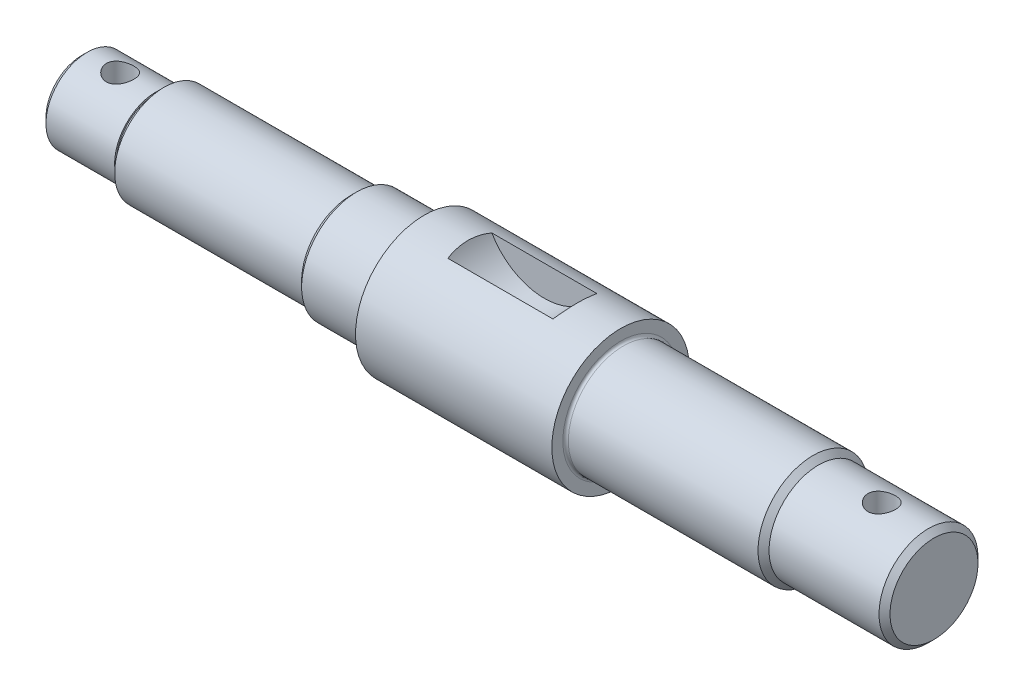
ISO-10303-21;
HEADER;
FILE_DESCRIPTION(('STEP AP214'),'2;1');
FILE_NAME('part.step','',(''),(''),'','','');
FILE_SCHEMA(('AUTOMOTIVE_DESIGN { 1 0 10303 214 1 1 1 1 }'));
ENDSEC;
DATA;
#1=APPLICATION_CONTEXT('core data for automotive mechanical design processes');
#2=APPLICATION_PROTOCOL_DEFINITION('international standard','automotive_design',2000,#1);
#3=PRODUCT_CONTEXT('',#1,'mechanical');
#4=PRODUCT('Part','Part','',(#3));
#5=PRODUCT_RELATED_PRODUCT_CATEGORY('part','',(#4));
#6=PRODUCT_DEFINITION_FORMATION('','',#4);
#7=PRODUCT_DEFINITION_CONTEXT('part definition',#1,'design');
#8=PRODUCT_DEFINITION('design','',#6,#7);
#9=PRODUCT_DEFINITION_SHAPE('','',#8);
#10=(LENGTH_UNIT() NAMED_UNIT(*) SI_UNIT(.MILLI.,.METRE.));
#11=(NAMED_UNIT(*) PLANE_ANGLE_UNIT() SI_UNIT($,.RADIAN.));
#12=(NAMED_UNIT(*) SI_UNIT($,.STERADIAN.) SOLID_ANGLE_UNIT());
#13=UNCERTAINTY_MEASURE_WITH_UNIT(LENGTH_MEASURE(1.E-05),#10,'distance_accuracy_value','');
#14=(GEOMETRIC_REPRESENTATION_CONTEXT(3) GLOBAL_UNCERTAINTY_ASSIGNED_CONTEXT((#13)) GLOBAL_UNIT_ASSIGNED_CONTEXT((#10,
#11,#12)) REPRESENTATION_CONTEXT('',''));
#15=CARTESIAN_POINT('',(0.,0.,0.));
#16=DIRECTION('',(0.,0.,1.));
#17=DIRECTION('',(1.,0.,0.));
#18=AXIS2_PLACEMENT_3D('',#15,#16,#17);
#19=CARTESIAN_POINT('',(155.,0.,0.));
#20=DIRECTION('',(1.,0.,0.));
#21=DIRECTION('',(0.,0.,-1.));
#22=AXIS2_PLACEMENT_3D('',#19,#20,#21);
#23=CYLINDRICAL_SURFACE('',#22,12.5);
#24=CARTESIAN_POINT('',(62.3,0.,0.));
#25=DIRECTION('',(1.,0.,0.));
#26=DIRECTION('',(0.,0.,-1.));
#27=AXIS2_PLACEMENT_3D('',#24,#25,#26);
#28=CIRCLE('',#27,12.5);
#29=CARTESIAN_POINT('',(62.3,0.,-12.5));
#30=VERTEX_POINT('',#29);
#31=EDGE_CURVE('E165',#30,#30,#28,.T.);
#32=ORIENTED_EDGE('',*,*,#31,.T.);
#33=EDGE_LOOP('',(#32));
#34=FACE_BOUND('',#33,.T.);
#35=CARTESIAN_POINT('',(98.,0.,0.));
#36=DIRECTION('',(1.,0.,0.));
#37=DIRECTION('',(0.,0.,-1.));
#38=AXIS2_PLACEMENT_3D('',#35,#36,#37);
#39=CIRCLE('',#38,12.5);
#40=CARTESIAN_POINT('',(98.,0.,-12.5));
#41=VERTEX_POINT('',#40);
#42=EDGE_CURVE('E168',#41,#41,#39,.T.);
#43=ORIENTED_EDGE('',*,*,#42,.F.);
#44=EDGE_LOOP('',(#43));
#45=FACE_BOUND('',#44,.T.);
#46=CARTESIAN_POINT('',(70.5991839527444,11.842719282327,-4.));
#47=CARTESIAN_POINT('',(70.5711926830263,11.8917156117757,-3.85494402529168));
#48=CARTESIAN_POINT('',(70.5451553475251,11.9381490672679,-3.70867030879479));
#49=CARTESIAN_POINT('',(70.4967755975671,12.0257437372073,-3.41395853570055));
#50=CARTESIAN_POINT('',(70.4744329601395,12.0669052697751,-3.26552061029944));
#51=CARTESIAN_POINT('',(70.4126424578915,12.1822344055781,-2.8174816413634));
#52=CARTESIAN_POINT('',(70.3784059982553,12.2482930461569,-2.51501804161143));
#53=CARTESIAN_POINT('',(70.3224635699344,12.3580046221654,-1.90427101375402));
#54=CARTESIAN_POINT('',(70.300785509179,12.4016076318492,-1.59597618401057));
#55=CARTESIAN_POINT('',(70.2691690979051,12.4656995854591,-0.976382997723523));
#56=CARTESIAN_POINT('',(70.2592310584647,12.4861879169095,-0.665084561812997));
#57=CARTESIAN_POINT('',(70.2506716327463,12.5038147620794,-0.0418568247993486));
#58=CARTESIAN_POINT('',(70.2520437568093,12.500966666014,0.270072011868759));
#59=CARTESIAN_POINT('',(70.2661500567885,12.4719806173032,0.892642047172848));
#60=CARTESIAN_POINT('',(70.2788859218021,12.4458392023584,1.20328304748952));
#61=CARTESIAN_POINT('',(70.3162146723074,12.3706573639039,1.82020810943418));
#62=CARTESIAN_POINT('',(70.3407757697093,12.3216783425542,2.12650159839234));
#63=CARTESIAN_POINT('',(70.4027332735505,12.201434168835,2.73322605572648));
#64=CARTESIAN_POINT('',(70.4401214359915,12.130183333244,3.03366065887986));
#65=CARTESIAN_POINT('',(70.5015912906785,12.0170604757192,3.44296739669271));
#66=CARTESIAN_POINT('',(70.5195928788041,11.9842876759461,3.55535041723217));
#67=CARTESIAN_POINT('',(70.5577481662195,11.9157411691357,3.77872220549976));
#68=CARTESIAN_POINT('',(70.5779000436322,11.8799700079478,3.88971206587697));
#69=CARTESIAN_POINT('',(70.5991839527444,11.842719282327,4.));
#70=B_SPLINE_CURVE_WITH_KNOTS('',3,(#46,#47,#48,#49,#50,#51,#52,#53,#54,#55,#56,#57,#58,#59,#60,
#61,#62,#63,#64,#65,#66,#67,#68,#69),.UNSPECIFIED.,.F.,.F.,(4,2,2,2,2,2,2,2,2,2,2,4),(0.,
0.466853020500423,0.933677856670467,1.86688702951262,2.8021621510291,3.73746205419398,
4.67222532897254,5.6071275693648,6.53953055913781,7.47133540948988,7.82660392793132,
8.18157379263428),.UNSPECIFIED.);
#71=CARTESIAN_POINT('',(70.5991839527444,11.842719282327,-4.));
#72=VERTEX_POINT('',#71);
#73=CARTESIAN_POINT('',(70.5991839527444,11.842719282327,4.));
#74=VERTEX_POINT('',#73);
#75=EDGE_CURVE('E54',#72,#74,#70,.T.);
#76=ORIENTED_EDGE('',*,*,#75,.F.);
#77=DIRECTION('',(1.,0.,0.));
#78=VECTOR('',#77,1.);
#79=CARTESIAN_POINT('',(155.,11.842719282327,-4.));
#80=LINE('',#79,#78);
#81=CARTESIAN_POINT('',(89.7008160472555,11.842719282327,-4.));
#82=VERTEX_POINT('',#81);
#83=EDGE_CURVE('E11',#72,#82,#80,.T.);
#84=ORIENTED_EDGE('',*,*,#83,.T.);
#85=CARTESIAN_POINT('',(89.7008160472555,11.842719282327,4.));
#86=CARTESIAN_POINT('',(89.7288073169737,11.8917156117757,3.85494402529168));
#87=CARTESIAN_POINT('',(89.7548446524748,11.9381490672679,3.70867030879479));
#88=CARTESIAN_POINT('',(89.8032244024328,12.0257437372073,3.41395853570055));
#89=CARTESIAN_POINT('',(89.8255670398605,12.0669052697751,3.26552061029944));
#90=CARTESIAN_POINT('',(89.8873575421085,12.1822344055781,2.8174816413634));
#91=CARTESIAN_POINT('',(89.9215940017447,12.2482930461569,2.51501804161143));
#92=CARTESIAN_POINT('',(89.9775364300656,12.3580046221654,1.90427101375402));
#93=CARTESIAN_POINT('',(89.9992144908209,12.4016076318492,1.59597618401057));
#94=CARTESIAN_POINT('',(90.0308309020948,12.4656995854591,0.976382997723524));
#95=CARTESIAN_POINT('',(90.0407689415353,12.4861879169095,0.665084561812998));
#96=CARTESIAN_POINT('',(90.0493283672536,12.5038147620794,0.0418568247993486));
#97=CARTESIAN_POINT('',(90.0479562431906,12.500966666014,-0.270072011868759));
#98=CARTESIAN_POINT('',(90.0338499432114,12.4719806173032,-0.892642047172848));
#99=CARTESIAN_POINT('',(90.0211140781979,12.4458392023584,-1.20328304748952));
#100=CARTESIAN_POINT('',(89.9837853276925,12.3706573639039,-1.82020810943418));
#101=CARTESIAN_POINT('',(89.9592242302906,12.3216783425542,-2.12650159839234));
#102=CARTESIAN_POINT('',(89.8972667264494,12.201434168835,-2.73322605572648));
#103=CARTESIAN_POINT('',(89.8598785640084,12.130183333244,-3.03366065887986));
#104=CARTESIAN_POINT('',(89.7984087093215,12.0170604757192,-3.44296739669271));
#105=CARTESIAN_POINT('',(89.7804071211958,11.9842876759461,-3.55535041723217));
#106=CARTESIAN_POINT('',(89.7422518337805,11.9157411691357,-3.77872220549976));
#107=CARTESIAN_POINT('',(89.7220999563677,11.8799700079478,-3.88971206587697));
#108=CARTESIAN_POINT('',(89.7008160472555,11.842719282327,-4.));
#109=B_SPLINE_CURVE_WITH_KNOTS('',3,(#85,#86,#87,#88,#89,#90,#91,#92,#93,#94,#95,#96,#97,#98,
#99,#100,#101,#102,#103,#104,#105,#106,#107,#108),.UNSPECIFIED.,.F.,.F.,(4,2,2,2,2,2,2,2,2,2,2,
4),(0.,0.466853020500423,0.933677856670467,1.86688702951262,2.8021621510291,3.73746205419398,
4.67222532897254,5.6071275693648,6.53953055913781,7.47133540948988,7.82660392793132,
8.18157379263428),.UNSPECIFIED.);
#110=CARTESIAN_POINT('',(89.7008160472555,11.842719282327,4.));
#111=VERTEX_POINT('',#110);
#112=EDGE_CURVE('E68',#111,#82,#109,.T.);
#113=ORIENTED_EDGE('',*,*,#112,.F.);
#114=DIRECTION('',(1.,0.,0.));
#115=VECTOR('',#114,1.);
#116=CARTESIAN_POINT('',(155.,11.842719282327,4.));
#117=LINE('',#116,#115);
#118=EDGE_CURVE('E75',#74,#111,#117,.T.);
#119=ORIENTED_EDGE('',*,*,#118,.F.);
#120=EDGE_LOOP('',(#76,#84,#113,#119));
#121=FACE_BOUND('',#120,.T.);
#122=ADVANCED_FACE('F39',(#34,#45,#121),#23,.T.);
#123=CARTESIAN_POINT('',(155.,8.99999999999998,0.));
#124=DIRECTION('',(1.,0.,0.));
#125=DIRECTION('',(0.,0.,-1.));
#126=AXIS2_PLACEMENT_3D('',#123,#124,#125);
#127=PLANE('',#126);
#128=CARTESIAN_POINT('',(155.,0.,0.));
#129=DIRECTION('',(1.,0.,0.));
#130=DIRECTION('',(0.,0.,-1.));
#131=AXIS2_PLACEMENT_3D('',#128,#129,#130);
#132=CIRCLE('',#131,7.99999999999999);
#133=CARTESIAN_POINT('',(155.,0.,-7.99999999999999));
#134=VERTEX_POINT('',#133);
#135=EDGE_CURVE('E187',#134,#134,#132,.T.);
#136=ORIENTED_EDGE('',*,*,#135,.T.);
#137=EDGE_LOOP('',(#136));
#138=FACE_BOUND('',#137,.T.);
#139=ADVANCED_FACE('F155',(#138),#127,.T.);
#140=CARTESIAN_POINT('',(155.,0.,0.));
#141=DIRECTION('',(1.,0.,0.));
#142=DIRECTION('',(0.,0.,-1.));
#143=AXIS2_PLACEMENT_3D('',#140,#141,#142);
#144=CYLINDRICAL_SURFACE('',#143,8.99999999999998);
#145=CARTESIAN_POINT('',(145.5,-8.64580823289528,2.5));
#146=CARTESIAN_POINT('',(145.36251304671,-8.64581037496085,2.49999714996617));
#147=CARTESIAN_POINT('',(145.224996759927,-8.64912360937158,2.48861977425243));
#148=CARTESIAN_POINT('',(144.953951404569,-8.66197474072457,2.44350693717148));
#149=CARTESIAN_POINT('',(144.820424144722,-8.6715154178623,2.40976148964065));
#150=CARTESIAN_POINT('',(144.561317673241,-8.69565935423006,2.32112008680784));
#151=CARTESIAN_POINT('',(144.435726959246,-8.71025507855493,2.26625559744292));
#152=CARTESIAN_POINT('',(144.195509077945,-8.74285475062132,2.13703377417483));
#153=CARTESIAN_POINT('',(144.080883025715,-8.76085904445196,2.06267446056934));
#154=CARTESIAN_POINT('',(143.862738144417,-8.79879482245344,1.89441531907551));
#155=CARTESIAN_POINT('',(143.759560882364,-8.81876275539878,1.80008077870934));
#156=CARTESIAN_POINT('',(143.570269160961,-8.85806239814546,1.59548286960025));
#157=CARTESIAN_POINT('',(143.484156600035,-8.8773940369607,1.4852177309572));
#158=CARTESIAN_POINT('',(143.329995538839,-8.91365202741972,1.24950042890598));
#159=CARTESIAN_POINT('',(143.262289408156,-8.93053038427287,1.12381632761082));
#160=CARTESIAN_POINT('',(143.14910072624,-8.95956018312962,0.862300362049417));
#161=CARTESIAN_POINT('',(143.103614095426,-8.97171249276933,0.726470365890889));
#162=CARTESIAN_POINT('',(143.037269054527,-8.98966318340412,0.452086360205861));
#163=CARTESIAN_POINT('',(143.015828957739,-8.99561138050701,0.313682975067015));
#164=CARTESIAN_POINT('',(142.996352543344,-9.0010086738428,0.0351244568787243));
#165=CARTESIAN_POINT('',(142.998311988443,-9.00045894674932,-0.105030354422782));
#166=CARTESIAN_POINT('',(143.025175552384,-8.99303086374214,-0.379054247152551));
#167=CARTESIAN_POINT('',(143.049450763969,-8.98632598075259,-0.512990410045104));
#168=CARTESIAN_POINT('',(143.119237138233,-8.96754760099032,-0.774807483322486));
#169=CARTESIAN_POINT('',(143.164749560655,-8.95547378574643,-0.902688034006093));
#170=CARTESIAN_POINT('',(143.276182080583,-8.92706250606228,-1.15033359179949));
#171=CARTESIAN_POINT('',(143.342311909524,-8.91068150784285,-1.26999902658789));
#172=CARTESIAN_POINT('',(143.49293961582,-8.87541221350136,-1.49674457308827));
#173=CARTESIAN_POINT('',(143.577441332692,-8.85652339359455,-1.60382204684013));
#174=CARTESIAN_POINT('',(143.765728657777,-8.81753663226072,-1.8061067603823));
#175=CARTESIAN_POINT('',(143.870061805646,-8.79741936953616,-1.90080125058981));
#176=CARTESIAN_POINT('',(144.093332675122,-8.75880383152744,-2.07148108085114));
#177=CARTESIAN_POINT('',(144.212271450118,-8.74030567318145,-2.14746507027558));
#178=CARTESIAN_POINT('',(144.462564721412,-8.70694013940654,-2.27900238121954));
#179=CARTESIAN_POINT('',(144.594002269306,-8.69209980055973,-2.3344050164098));
#180=CARTESIAN_POINT('',(144.864843595759,-8.66806022503137,-2.42215297643583));
#181=CARTESIAN_POINT('',(145.00424519225,-8.65885945119344,-2.45450458459976));
#182=CARTESIAN_POINT('',(145.282234513998,-8.64747148287151,-2.49432455486228));
#183=CARTESIAN_POINT('',(145.420703234809,-8.64506746157859,-2.50256249342185));
#184=CARTESIAN_POINT('',(145.697041990452,-8.64694988564763,-2.49605092061448));
#185=CARTESIAN_POINT('',(145.83491209335,-8.6512355492528,-2.48130409524807));
#186=CARTESIAN_POINT('',(146.103097746691,-8.66580389953323,-2.42992241428478));
#187=CARTESIAN_POINT('',(146.233511668847,-8.67595686836149,-2.39376059864354));
#188=CARTESIAN_POINT('',(146.486420227101,-8.70098664146815,-2.30111259188306));
#189=CARTESIAN_POINT('',(146.60891376272,-8.71586410048918,-2.24462358357885));
#190=CARTESIAN_POINT('',(146.845695368558,-8.74910362417901,-2.11139571215837));
#191=CARTESIAN_POINT('',(146.959721771038,-8.76753959855499,-2.03421067264883));
#192=CARTESIAN_POINT('',(147.173486244076,-8.80564999409986,-1.86232721847474));
#193=CARTESIAN_POINT('',(147.273221384664,-8.82532466803798,-1.76762522160664));
#194=CARTESIAN_POINT('',(147.458821470568,-8.86445019939345,-1.55981743646719));
#195=CARTESIAN_POINT('',(147.544146810068,-8.88387421295945,-1.4462235987098));
#196=CARTESIAN_POINT('',(147.694523971078,-8.91967402878591,-1.20588311286947));
#197=CARTESIAN_POINT('',(147.759576866794,-8.93604999253945,-1.07913716217182));
#198=CARTESIAN_POINT('',(147.866949591823,-8.96380327787491,-0.816978395233246));
#199=CARTESIAN_POINT('',(147.909441166067,-8.97521823979381,-0.681640101050656));
#200=CARTESIAN_POINT('',(147.970968173441,-8.99192942838895,-0.405376312895347));
#201=CARTESIAN_POINT('',(147.990009283144,-8.99722713582852,-0.264452179596259));
#202=CARTESIAN_POINT('',(148.003714329686,-9.00103042209331,0.013960152357653));
#203=CARTESIAN_POINT('',(147.999166707091,-8.99975568986335,0.151407064589656));
#204=CARTESIAN_POINT('',(147.967671437509,-8.99106088846501,0.423500619727726));
#205=CARTESIAN_POINT('',(147.94072476243,-8.98364108593444,0.55814738387382));
#206=CARTESIAN_POINT('',(147.865656776372,-8.96353984091203,0.819784983469313));
#207=CARTESIAN_POINT('',(147.817707402067,-8.95090116936264,0.946828656281146));
#208=CARTESIAN_POINT('',(147.702148061769,-8.92167820297649,1.19113920788314));
#209=CARTESIAN_POINT('',(147.634535166621,-8.90509332036377,1.30840462671538));
#210=CARTESIAN_POINT('',(147.479328057284,-8.86915397347005,1.53345112172908));
#211=CARTESIAN_POINT('',(147.391219913931,-8.84973411731034,1.64086726646983));
#212=CARTESIAN_POINT('',(147.198482069549,-8.81055920809078,1.83965563573723));
#213=CARTESIAN_POINT('',(147.093847901953,-8.79080406570365,1.93102350868099));
#214=CARTESIAN_POINT('',(146.867955482556,-8.7526355351999,2.09734241907801));
#215=CARTESIAN_POINT('',(146.746353610468,-8.73426670491593,2.17183796747971));
#216=CARTESIAN_POINT('',(146.491856012821,-8.70160385709123,2.29922652645138));
#217=CARTESIAN_POINT('',(146.35896712682,-8.68730739437857,2.35213250833711));
#218=CARTESIAN_POINT('',(146.105639870262,-8.66621345779748,2.42859494882474));
#219=CARTESIAN_POINT('',(145.986210594444,-8.65862660680176,2.45530563406018));
#220=CARTESIAN_POINT('',(145.744528351776,-8.64842338463343,2.49100820491654));
#221=CARTESIAN_POINT('',(145.622275776788,-8.64580632782192,2.50000253471396));
#222=CARTESIAN_POINT('',(145.5,-8.64580823289528,2.5));
#223=B_SPLINE_CURVE_WITH_KNOTS('',3,(#145,#146,#147,#148,#149,#150,#151,#152,#153,#154,#155,
#156,#157,#158,#159,#160,#161,#162,#163,#164,#165,#166,#167,#168,#169,#170,#171,#172,#173,#174,
#175,#176,#177,#178,#179,#180,#181,#182,#183,#184,#185,#186,#187,#188,#189,#190,#191,#192,#193,
#194,#195,#196,#197,#198,#199,#200,#201,#202,#203,#204,#205,#206,#207,#208,#209,#210,#211,#212,
#213,#214,#215,#216,#217,#218,#219,#220,#221,#222),.UNSPECIFIED.,.T.,.F.,(4,2,2,2,2,2,2,2,2,2,2,
2,2,2,2,2,2,2,2,2,2,2,2,2,2,2,2,2,2,2,2,2,2,2,2,2,2,2,4),(0.,0.412010791688976,
0.824205648454525,1.23578872527859,1.64741361462618,2.06913895760033,2.49091119062406,
2.92006196750631,3.34913392107922,3.7675863122474,4.18596292931721,4.59289867518081,
4.99985856264056,5.41110133303431,5.82243013129567,6.24742875551485,6.67245804954201,
7.10054057407687,7.52850636571891,7.94265637768503,8.35675799569093,8.76203677700907,
9.1673717483445,9.58226667645628,9.99724654423655,10.4253750626708,10.8534808913584,
11.2782793253857,11.7029749096957,12.1135686473819,12.5241445701256,12.9314203987337,
13.3387569278366,13.7576868945778,14.1767302818544,14.6060087946726,15.0350290098244,
15.4015066296816,15.767933686163),.UNSPECIFIED.);
#224=CARTESIAN_POINT('',(145.5,-8.64580823289528,2.5));
#225=VERTEX_POINT('',#224);
#226=EDGE_CURVE('E44',#225,#225,#223,.T.);
#227=ORIENTED_EDGE('',*,*,#226,.F.);
#228=EDGE_LOOP('',(#227));
#229=FACE_BOUND('',#228,.T.);
#230=CARTESIAN_POINT('',(145.5,8.64580823289528,2.5));
#231=CARTESIAN_POINT('',(145.63748695329,8.64581037496085,2.49999714996617));
#232=CARTESIAN_POINT('',(145.775003240073,8.64912360937158,2.48861977425243));
#233=CARTESIAN_POINT('',(146.046048595431,8.66197474072457,2.44350693717148));
#234=CARTESIAN_POINT('',(146.179575855278,8.6715154178623,2.40976148964064));
#235=CARTESIAN_POINT('',(146.43868232676,8.69565935423006,2.32112008680784));
#236=CARTESIAN_POINT('',(146.564273040754,8.71025507855493,2.26625559744292));
#237=CARTESIAN_POINT('',(146.804490922055,8.74285475062132,2.13703377417483));
#238=CARTESIAN_POINT('',(146.919116974285,8.76085904445196,2.06267446056934));
#239=CARTESIAN_POINT('',(147.137261855583,8.79879482245344,1.89441531907551));
#240=CARTESIAN_POINT('',(147.240439117636,8.81876275539877,1.80008077870935));
#241=CARTESIAN_POINT('',(147.429730839039,8.85806239814545,1.59548286960026));
#242=CARTESIAN_POINT('',(147.515843399965,8.8773940369607,1.4852177309572));
#243=CARTESIAN_POINT('',(147.670004461161,8.91365202741972,1.24950042890599));
#244=CARTESIAN_POINT('',(147.737710591844,8.93053038427287,1.12381632761083));
#245=CARTESIAN_POINT('',(147.85089927376,8.95956018312962,0.862300362049432));
#246=CARTESIAN_POINT('',(147.896385904574,8.97171249276933,0.726470365890896));
#247=CARTESIAN_POINT('',(147.962730945473,8.98966318340412,0.45208636020586));
#248=CARTESIAN_POINT('',(147.984171042261,8.99561138050701,0.313682975067014));
#249=CARTESIAN_POINT('',(148.003647456656,9.0010086738428,0.0351244568787245));
#250=CARTESIAN_POINT('',(148.001688011557,9.00045894674932,-0.105030354422782));
#251=CARTESIAN_POINT('',(147.974824447616,8.99303086374214,-0.379054247152551));
#252=CARTESIAN_POINT('',(147.950549236031,8.98632598075259,-0.512990410045104));
#253=CARTESIAN_POINT('',(147.880762861767,8.96754760099032,-0.774807483322486));
#254=CARTESIAN_POINT('',(147.835250439345,8.95547378574643,-0.902688034006093));
#255=CARTESIAN_POINT('',(147.723817919417,8.92706250606228,-1.15033359179949));
#256=CARTESIAN_POINT('',(147.657688090476,8.91068150784285,-1.26999902658789));
#257=CARTESIAN_POINT('',(147.50706038418,8.87541221350136,-1.49674457308827));
#258=CARTESIAN_POINT('',(147.422558667308,8.85652339359455,-1.60382204684013));
#259=CARTESIAN_POINT('',(147.234271342223,8.81753663226072,-1.8061067603823));
#260=CARTESIAN_POINT('',(147.129938194354,8.79741936953616,-1.9008012505898));
#261=CARTESIAN_POINT('',(146.906667324878,8.75880383152744,-2.07148108085113));
#262=CARTESIAN_POINT('',(146.787728549882,8.74030567318145,-2.14746507027557));
#263=CARTESIAN_POINT('',(146.537435278588,8.70694013940654,-2.27900238121954));
#264=CARTESIAN_POINT('',(146.405997730694,8.69209980055973,-2.3344050164098));
#265=CARTESIAN_POINT('',(146.135156404241,8.66806022503137,-2.42215297643583));
#266=CARTESIAN_POINT('',(145.99575480775,8.65885945119344,-2.45450458459976));
#267=CARTESIAN_POINT('',(145.717765486002,8.64747148287151,-2.49432455486228));
#268=CARTESIAN_POINT('',(145.579296765191,8.64506746157859,-2.50256249342185));
#269=CARTESIAN_POINT('',(145.302958009548,8.64694988564763,-2.49605092061448));
#270=CARTESIAN_POINT('',(145.16508790665,8.6512355492528,-2.48130409524807));
#271=CARTESIAN_POINT('',(144.896902253309,8.66580389953323,-2.42992241428478));
#272=CARTESIAN_POINT('',(144.766488331153,8.67595686836149,-2.39376059864354));
#273=CARTESIAN_POINT('',(144.513579772899,8.70098664146815,-2.30111259188306));
#274=CARTESIAN_POINT('',(144.39108623728,8.71586410048918,-2.24462358357885));
#275=CARTESIAN_POINT('',(144.154304631442,8.74910362417901,-2.11139571215837));
#276=CARTESIAN_POINT('',(144.040278228962,8.76753959855499,-2.03421067264883));
#277=CARTESIAN_POINT('',(143.826513755924,8.80564999409986,-1.86232721847474));
#278=CARTESIAN_POINT('',(143.726778615336,8.82532466803798,-1.76762522160664));
#279=CARTESIAN_POINT('',(143.541178529432,8.86445019939345,-1.55981743646719));
#280=CARTESIAN_POINT('',(143.455853189932,8.88387421295945,-1.4462235987098));
#281=CARTESIAN_POINT('',(143.305476028923,8.91967402878591,-1.20588311286947));
#282=CARTESIAN_POINT('',(143.240423133206,8.93604999253945,-1.07913716217182));
#283=CARTESIAN_POINT('',(143.133050408177,8.96380327787491,-0.816978395233246));
#284=CARTESIAN_POINT('',(143.090558833933,8.97521823979381,-0.681640101050656));
#285=CARTESIAN_POINT('',(143.029031826559,8.99192942838895,-0.405376312895347));
#286=CARTESIAN_POINT('',(143.009990716856,8.99722713582852,-0.264452179596259));
#287=CARTESIAN_POINT('',(142.996285670314,9.00103042209331,0.013960152357653));
#288=CARTESIAN_POINT('',(143.000833292909,8.99975568986335,0.151407064589656));
#289=CARTESIAN_POINT('',(143.032328562491,8.99106088846501,0.423500619727726));
#290=CARTESIAN_POINT('',(143.05927523757,8.98364108593444,0.55814738387382));
#291=CARTESIAN_POINT('',(143.134343223628,8.96353984091203,0.819784983469313));
#292=CARTESIAN_POINT('',(143.182292597933,8.95090116936264,0.946828656281146));
#293=CARTESIAN_POINT('',(143.297851938231,8.92167820297649,1.19113920788314));
#294=CARTESIAN_POINT('',(143.365464833379,8.90509332036377,1.30840462671538));
#295=CARTESIAN_POINT('',(143.520671942716,8.86915397347005,1.53345112172909));
#296=CARTESIAN_POINT('',(143.608780086069,8.84973411731034,1.64086726646984));
#297=CARTESIAN_POINT('',(143.801517930452,8.81055920809078,1.83965563573725));
#298=CARTESIAN_POINT('',(143.906152098048,8.79080406570365,1.931023508681));
#299=CARTESIAN_POINT('',(144.132044517444,8.7526355351999,2.09734241907802));
#300=CARTESIAN_POINT('',(144.253646389532,8.73426670491592,2.17183796747972));
#301=CARTESIAN_POINT('',(144.508143987179,8.70160385709123,2.29922652645138));
#302=CARTESIAN_POINT('',(144.64103287318,8.68730739437857,2.35213250833712));
#303=CARTESIAN_POINT('',(144.894360129738,8.66621345779748,2.42859494882474));
#304=CARTESIAN_POINT('',(145.013789405556,8.65862660680176,2.45530563406018));
#305=CARTESIAN_POINT('',(145.255471648224,8.64842338463343,2.49100820491654));
#306=CARTESIAN_POINT('',(145.377724223212,8.64580632782192,2.50000253471396));
#307=CARTESIAN_POINT('',(145.5,8.64580823289528,2.5));
#308=B_SPLINE_CURVE_WITH_KNOTS('',3,(#230,#231,#232,#233,#234,#235,#236,#237,#238,#239,#240,
#241,#242,#243,#244,#245,#246,#247,#248,#249,#250,#251,#252,#253,#254,#255,#256,#257,#258,#259,
#260,#261,#262,#263,#264,#265,#266,#267,#268,#269,#270,#271,#272,#273,#274,#275,#276,#277,#278,
#279,#280,#281,#282,#283,#284,#285,#286,#287,#288,#289,#290,#291,#292,#293,#294,#295,#296,#297,
#298,#299,#300,#301,#302,#303,#304,#305,#306,#307),.UNSPECIFIED.,.T.,.F.,(4,2,2,2,2,2,2,2,2,2,2,
2,2,2,2,2,2,2,2,2,2,2,2,2,2,2,2,2,2,2,2,2,2,2,2,2,2,2,4),(0.,0.412010791688976,
0.824205648454525,1.23578872527859,1.64741361462618,2.06913895760032,2.49091119062406,
2.92006196750629,3.34913392107923,3.7675863122474,4.18596292931722,4.59289867518081,
4.99985856264056,5.41110133303432,5.82243013129567,6.24742875551482,6.67245804954201,
7.10054057407687,7.52850636571892,7.94265637768504,8.35675799569093,8.76203677700908,
9.16737174834451,9.58226667645629,9.99724654423655,10.4253750626708,10.8534808913584,
11.2782793253857,11.7029749096957,12.1135686473819,12.5241445701257,12.9314203987337,
13.3387569278366,13.7576868945778,14.1767302818544,14.6060087946726,15.0350290098244,
15.4015066296816,15.767933686163),.UNSPECIFIED.);
#309=CARTESIAN_POINT('',(145.5,8.64580823289528,2.5));
#310=VERTEX_POINT('',#309);
#311=EDGE_CURVE('E135',#310,#310,#308,.T.);
#312=ORIENTED_EDGE('',*,*,#311,.F.);
#313=EDGE_LOOP('',(#312));
#314=FACE_BOUND('',#313,.T.);
#315=CARTESIAN_POINT('',(154.,0.,0.));
#316=DIRECTION('',(1.,0.,0.));
#317=DIRECTION('',(0.,0.,-1.));
#318=AXIS2_PLACEMENT_3D('',#315,#316,#317);
#319=CIRCLE('',#318,8.99999999999998);
#320=CARTESIAN_POINT('',(154.,0.,-8.99999999999998));
#321=VERTEX_POINT('',#320);
#322=EDGE_CURVE('E79',#321,#321,#319,.F.);
#323=ORIENTED_EDGE('',*,*,#322,.T.);
#324=EDGE_LOOP('',(#323));
#325=FACE_BOUND('',#324,.T.);
#326=CARTESIAN_POINT('',(134.,0.,0.));
#327=DIRECTION('',(1.,0.,0.));
#328=DIRECTION('',(0.,0.,-1.));
#329=AXIS2_PLACEMENT_3D('',#326,#327,#328);
#330=CIRCLE('',#329,8.99999999999998);
#331=CARTESIAN_POINT('',(134.,0.,-8.99999999999998));
#332=VERTEX_POINT('',#331);
#333=EDGE_CURVE('E184',#332,#332,#330,.T.);
#334=ORIENTED_EDGE('',*,*,#333,.T.);
#335=EDGE_LOOP('',(#334));
#336=FACE_BOUND('',#335,.T.);
#337=ADVANCED_FACE('F160',(#229,#314,#325,#336),#144,.T.);
#338=CARTESIAN_POINT('',(134.,0.,0.));
#339=DIRECTION('',(-1.,0.,0.));
#340=DIRECTION('',(0.,0.,1.));
#341=AXIS2_PLACEMENT_3D('',#338,#339,#340);
#342=CONICAL_SURFACE('',#341,8.99999999999998,0.785398163397436);
#343=CARTESIAN_POINT('',(133.,0.,0.));
#344=DIRECTION('',(1.,0.,0.));
#345=DIRECTION('',(0.,0.,-1.));
#346=AXIS2_PLACEMENT_3D('',#343,#344,#345);
#347=CIRCLE('',#346,9.99999999999999);
#348=CARTESIAN_POINT('',(133.,0.,-9.99999999999999));
#349=VERTEX_POINT('',#348);
#350=EDGE_CURVE('E181',#349,#349,#347,.T.);
#351=ORIENTED_EDGE('',*,*,#350,.T.);
#352=EDGE_LOOP('',(#351));
#353=FACE_BOUND('',#352,.T.);
#354=ORIENTED_EDGE('',*,*,#333,.F.);
#355=EDGE_LOOP('',(#354));
#356=FACE_BOUND('',#355,.T.);
#357=ADVANCED_FACE('F232',(#353,#356),#342,.T.);
#358=CARTESIAN_POINT('',(155.,0.,0.));
#359=DIRECTION('',(1.,0.,0.));
#360=DIRECTION('',(0.,0.,-1.));
#361=AXIS2_PLACEMENT_3D('',#358,#359,#360);
#362=CYLINDRICAL_SURFACE('',#361,9.99999999999999);
#363=CARTESIAN_POINT('',(98.5,0.,0.));
#364=DIRECTION('',(1.,0.,0.));
#365=DIRECTION('',(0.,0.,-1.));
#366=AXIS2_PLACEMENT_3D('',#363,#364,#365);
#367=CIRCLE('',#366,9.99999999999999);
#368=CARTESIAN_POINT('',(98.5,0.,-9.99999999999999));
#369=VERTEX_POINT('',#368);
#370=EDGE_CURVE('E173',#369,#369,#367,.T.);
#371=ORIENTED_EDGE('',*,*,#370,.T.);
#372=EDGE_LOOP('',(#371));
#373=FACE_BOUND('',#372,.T.);
#374=ORIENTED_EDGE('',*,*,#350,.F.);
#375=EDGE_LOOP('',(#374));
#376=FACE_BOUND('',#375,.T.);
#377=ADVANCED_FACE('F374',(#373,#376),#362,.T.);
#378=CARTESIAN_POINT('',(98.5,0.,0.));
#379=DIRECTION('',(1.,0.,0.));
#380=DIRECTION('',(0.,0.,-1.));
#381=AXIS2_PLACEMENT_3D('',#378,#379,#380);
#382=TOROIDAL_SURFACE('',#381,10.5,0.5);
#383=CARTESIAN_POINT('',(98.,0.,0.));
#384=DIRECTION('',(1.,0.,0.));
#385=DIRECTION('',(0.,0.,-1.));
#386=AXIS2_PLACEMENT_3D('',#383,#384,#385);
#387=CIRCLE('',#386,10.5);
#388=CARTESIAN_POINT('',(98.,0.,-10.5));
#389=VERTEX_POINT('',#388);
#390=EDGE_CURVE('E170',#389,#389,#387,.T.);
#391=ORIENTED_EDGE('',*,*,#390,.T.);
#392=EDGE_LOOP('',(#391));
#393=FACE_BOUND('',#392,.T.);
#394=ORIENTED_EDGE('',*,*,#370,.F.);
#395=EDGE_LOOP('',(#394));
#396=FACE_BOUND('',#395,.T.);
#397=ADVANCED_FACE('F366',(#393,#396),#382,.F.);
#398=CARTESIAN_POINT('',(98.,12.5,0.));
#399=DIRECTION('',(1.,0.,0.));
#400=DIRECTION('',(0.,0.,-1.));
#401=AXIS2_PLACEMENT_3D('',#398,#399,#400);
#402=PLANE('',#401);
#403=ORIENTED_EDGE('',*,*,#42,.T.);
#404=EDGE_LOOP('',(#403));
#405=FACE_BOUND('',#404,.T.);
#406=ORIENTED_EDGE('',*,*,#390,.F.);
#407=EDGE_LOOP('',(#406));
#408=FACE_BOUND('',#407,.T.);
#409=ADVANCED_FACE('F357',(#405,#408),#402,.T.);
#410=CARTESIAN_POINT('',(62.3,10.5,0.));
#411=DIRECTION('',(-1.,0.,0.));
#412=DIRECTION('',(0.,0.,1.));
#413=AXIS2_PLACEMENT_3D('',#410,#411,#412);
#414=PLANE('',#413);
#415=CARTESIAN_POINT('',(62.3,0.,0.));
#416=DIRECTION('',(1.,0.,0.));
#417=DIRECTION('',(0.,0.,-1.));
#418=AXIS2_PLACEMENT_3D('',#415,#416,#417);
#419=CIRCLE('',#418,10.5);
#420=CARTESIAN_POINT('',(62.3,0.,-10.5));
#421=VERTEX_POINT('',#420);
#422=EDGE_CURVE('E175',#421,#421,#419,.T.);
#423=ORIENTED_EDGE('',*,*,#422,.T.);
#424=EDGE_LOOP('',(#423));
#425=FACE_BOUND('',#424,.T.);
#426=ORIENTED_EDGE('',*,*,#31,.F.);
#427=EDGE_LOOP('',(#426));
#428=FACE_BOUND('',#427,.T.);
#429=ADVANCED_FACE('F347',(#425,#428),#414,.T.);
#430=CARTESIAN_POINT('',(61.8,0.,0.));
#431=DIRECTION('',(1.,0.,0.));
#432=DIRECTION('',(0.,0.,-1.));
#433=AXIS2_PLACEMENT_3D('',#430,#431,#432);
#434=TOROIDAL_SURFACE('',#433,10.5,0.5);
#435=CARTESIAN_POINT('',(61.8,0.,0.));
#436=DIRECTION('',(1.,0.,0.));
#437=DIRECTION('',(0.,0.,-1.));
#438=AXIS2_PLACEMENT_3D('',#435,#436,#437);
#439=CIRCLE('',#438,9.99999999999999);
#440=CARTESIAN_POINT('',(61.8,0.,-9.99999999999999));
#441=VERTEX_POINT('',#440);
#442=EDGE_CURVE('E443',#441,#441,#439,.T.);
#443=ORIENTED_EDGE('',*,*,#442,.T.);
#444=EDGE_LOOP('',(#443));
#445=FACE_BOUND('',#444,.T.);
#446=ORIENTED_EDGE('',*,*,#422,.F.);
#447=EDGE_LOOP('',(#446));
#448=FACE_BOUND('',#447,.T.);
#449=ADVANCED_FACE('F337',(#445,#448),#434,.F.);
#450=CARTESIAN_POINT('',(155.,0.,0.));
#451=DIRECTION('',(1.,0.,0.));
#452=DIRECTION('',(0.,0.,-1.));
#453=AXIS2_PLACEMENT_3D('',#450,#451,#452);
#454=CYLINDRICAL_SURFACE('',#453,9.99999999999999);
#455=CARTESIAN_POINT('',(50.,0.,0.));
#456=DIRECTION('',(1.,0.,0.));
#457=DIRECTION('',(0.,0.,-1.));
#458=AXIS2_PLACEMENT_3D('',#455,#456,#457);
#459=CIRCLE('',#458,9.99999999999999);
#460=CARTESIAN_POINT('',(50.,0.,-9.99999999999999));
#461=VERTEX_POINT('',#460);
#462=EDGE_CURVE('E445',#461,#461,#459,.T.);
#463=ORIENTED_EDGE('',*,*,#462,.T.);
#464=EDGE_LOOP('',(#463));
#465=FACE_BOUND('',#464,.T.);
#466=ORIENTED_EDGE('',*,*,#442,.F.);
#467=EDGE_LOOP('',(#466));
#468=FACE_BOUND('',#467,.T.);
#469=ADVANCED_FACE('F327',(#465,#468),#454,.T.);
#470=CARTESIAN_POINT('',(50.,0.,0.));
#471=DIRECTION('',(1.,0.,0.));
#472=DIRECTION('',(0.,0.,-1.));
#473=AXIS2_PLACEMENT_3D('',#470,#471,#472);
#474=CONICAL_SURFACE('',#473,9.99999999999999,0.785398163397457);
#475=CARTESIAN_POINT('',(49.,0.,0.));
#476=DIRECTION('',(1.,0.,0.));
#477=DIRECTION('',(0.,0.,-1.));
#478=AXIS2_PLACEMENT_3D('',#475,#476,#477);
#479=CIRCLE('',#478,8.99999999999998);
#480=CARTESIAN_POINT('',(49.,0.,-8.99999999999998));
#481=VERTEX_POINT('',#480);
#482=EDGE_CURVE('E450',#481,#481,#479,.T.);
#483=ORIENTED_EDGE('',*,*,#482,.T.);
#484=EDGE_LOOP('',(#483));
#485=FACE_BOUND('',#484,.T.);
#486=ORIENTED_EDGE('',*,*,#462,.F.);
#487=EDGE_LOOP('',(#486));
#488=FACE_BOUND('',#487,.T.);
#489=ADVANCED_FACE('F317',(#485,#488),#474,.T.);
#490=CARTESIAN_POINT('',(155.,0.,0.));
#491=DIRECTION('',(1.,0.,0.));
#492=DIRECTION('',(0.,0.,-1.));
#493=AXIS2_PLACEMENT_3D('',#490,#491,#492);
#494=CYLINDRICAL_SURFACE('',#493,8.99999999999998);
#495=CARTESIAN_POINT('',(15.,0.,0.));
#496=DIRECTION('',(1.,0.,0.));
#497=DIRECTION('',(0.,0.,-1.));
#498=AXIS2_PLACEMENT_3D('',#495,#496,#497);
#499=CIRCLE('',#498,8.99999999999998);
#500=CARTESIAN_POINT('',(15.,0.,-8.99999999999998));
#501=VERTEX_POINT('',#500);
#502=EDGE_CURVE('E453',#501,#501,#499,.T.);
#503=ORIENTED_EDGE('',*,*,#502,.T.);
#504=EDGE_LOOP('',(#503));
#505=FACE_BOUND('',#504,.T.);
#506=ORIENTED_EDGE('',*,*,#482,.F.);
#507=EDGE_LOOP('',(#506));
#508=FACE_BOUND('',#507,.T.);
#509=ADVANCED_FACE('F307',(#505,#508),#494,.T.);
#510=CARTESIAN_POINT('',(15.,7.19999999999998,0.));
#511=DIRECTION('',(-1.,0.,0.));
#512=DIRECTION('',(0.,0.,1.));
#513=AXIS2_PLACEMENT_3D('',#510,#511,#512);
#514=PLANE('',#513);
#515=CARTESIAN_POINT('',(15.,0.,0.));
#516=DIRECTION('',(1.,0.,0.));
#517=DIRECTION('',(0.,0.,-1.));
#518=AXIS2_PLACEMENT_3D('',#515,#516,#517);
#519=CIRCLE('',#518,7.19999999999998);
#520=CARTESIAN_POINT('',(15.,0.,-7.19999999999998));
#521=VERTEX_POINT('',#520);
#522=EDGE_CURVE('E456',#521,#521,#519,.T.);
#523=ORIENTED_EDGE('',*,*,#522,.T.);
#524=EDGE_LOOP('',(#523));
#525=FACE_BOUND('',#524,.T.);
#526=ORIENTED_EDGE('',*,*,#502,.F.);
#527=EDGE_LOOP('',(#526));
#528=FACE_BOUND('',#527,.T.);
#529=ADVANCED_FACE('F298',(#525,#528),#514,.T.);
#530=CARTESIAN_POINT('',(155.,0.,0.));
#531=DIRECTION('',(1.,0.,0.));
#532=DIRECTION('',(0.,0.,-1.));
#533=AXIS2_PLACEMENT_3D('',#530,#531,#532);
#534=CYLINDRICAL_SURFACE('',#533,7.19999999999998);
#535=CARTESIAN_POINT('',(13.5,0.,0.));
#536=DIRECTION('',(1.,0.,0.));
#537=DIRECTION('',(0.,0.,-1.));
#538=AXIS2_PLACEMENT_3D('',#535,#536,#537);
#539=CIRCLE('',#538,7.19999999999998);
#540=CARTESIAN_POINT('',(13.5,0.,-7.19999999999998));
#541=VERTEX_POINT('',#540);
#542=EDGE_CURVE('E459',#541,#541,#539,.T.);
#543=ORIENTED_EDGE('',*,*,#542,.T.);
#544=EDGE_LOOP('',(#543));
#545=FACE_BOUND('',#544,.T.);
#546=ORIENTED_EDGE('',*,*,#522,.F.);
#547=EDGE_LOOP('',(#546));
#548=FACE_BOUND('',#547,.T.);
#549=ADVANCED_FACE('F289',(#545,#548),#534,.T.);
#550=CARTESIAN_POINT('',(13.5,7.49999999999998,0.));
#551=DIRECTION('',(1.,0.,0.));
#552=DIRECTION('',(0.,0.,-1.));
#553=AXIS2_PLACEMENT_3D('',#550,#551,#552);
#554=PLANE('',#553);
#555=CARTESIAN_POINT('',(13.5,0.,0.));
#556=DIRECTION('',(1.,0.,0.));
#557=DIRECTION('',(0.,0.,-1.));
#558=AXIS2_PLACEMENT_3D('',#555,#556,#557);
#559=CIRCLE('',#558,7.49999999999998);
#560=CARTESIAN_POINT('',(13.5,0.,-7.49999999999998));
#561=VERTEX_POINT('',#560);
#562=EDGE_CURVE('E462',#561,#561,#559,.T.);
#563=ORIENTED_EDGE('',*,*,#562,.T.);
#564=EDGE_LOOP('',(#563));
#565=FACE_BOUND('',#564,.T.);
#566=ORIENTED_EDGE('',*,*,#542,.F.);
#567=EDGE_LOOP('',(#566));
#568=FACE_BOUND('',#567,.T.);
#569=ADVANCED_FACE('F119',(#565,#568),#554,.T.);
#570=CARTESIAN_POINT('',(155.,0.,0.));
#571=DIRECTION('',(1.,0.,0.));
#572=DIRECTION('',(0.,0.,-1.));
#573=AXIS2_PLACEMENT_3D('',#570,#571,#572);
#574=CYLINDRICAL_SURFACE('',#573,7.49999999999998);
#575=CARTESIAN_POINT('',(7.,-7.07106781186545,2.5));
#576=CARTESIAN_POINT('',(6.86382956290982,-7.07106736326083,2.50000064486928));
#577=CARTESIAN_POINT('',(6.72766300044102,-7.07504423227141,2.48883695921381));
#578=CARTESIAN_POINT('',(6.45936394751438,-7.09043935203135,2.44462782922202));
#579=CARTESIAN_POINT('',(6.32723212531883,-7.1018588285547,2.41157878042099));
#580=CARTESIAN_POINT('',(6.07093276750678,-7.13070509221977,2.32488871421226));
#581=CARTESIAN_POINT('',(5.94675017639321,-7.14812009928302,2.27128805350811));
#582=CARTESIAN_POINT('',(5.7090998786301,-7.1869780502581,2.14515407110345));
#583=CARTESIAN_POINT('',(5.59563454361592,-7.20842188259029,2.07261657215046));
#584=CARTESIAN_POINT('',(5.37820009415422,-7.25386223518681,1.90762786610719));
#585=CARTESIAN_POINT('',(5.27471142832068,-7.27792237111608,1.8145608534448));
#586=CARTESIAN_POINT('',(5.0844829969384,-7.32534662002505,1.61246916803599));
#587=CARTESIAN_POINT('',(4.99774592104408,-7.34871062072402,1.50344193763094));
#588=CARTESIAN_POINT('',(4.84130275667602,-7.39284667304495,1.26901126991252));
#589=CARTESIAN_POINT('',(4.77210007345511,-7.41353519254012,1.14325477806131));
#590=CARTESIAN_POINT('',(4.65602103718123,-7.44923966927455,0.881078057468684));
#591=CARTESIAN_POINT('',(4.60913866705774,-7.46425715507503,0.744660714218029));
#592=CARTESIAN_POINT('',(4.54066036341902,-7.48647688579765,0.470072043583735));
#593=CARTESIAN_POINT('',(4.51824138435748,-7.49393286943896,0.33212688713242));
#594=CARTESIAN_POINT('',(4.49670926659835,-7.50109020545618,0.054244687060223));
#595=CARTESIAN_POINT('',(4.49759012086897,-7.50079355657237,-0.0856918338597418));
#596=CARTESIAN_POINT('',(4.52211063641507,-7.49265099046826,-0.357758787984537));
#597=CARTESIAN_POINT('',(4.54485632118622,-7.48510161887792,-0.489980121479142));
#598=CARTESIAN_POINT('',(4.61098245245118,-7.46367418349327,-0.74860859705543));
#599=CARTESIAN_POINT('',(4.65436429744956,-7.44979569077953,-0.87501534444804));
#600=CARTESIAN_POINT('',(4.76105329326515,-7.41689175733059,-1.12038118710493));
#601=CARTESIAN_POINT('',(4.82461484636628,-7.39780106310037,-1.23922055242211));
#602=CARTESIAN_POINT('',(4.96964926362164,-7.35645982597296,-1.46481081381831));
#603=CARTESIAN_POINT('',(5.05112710831908,-7.33420840503665,-1.57155833596335));
#604=CARTESIAN_POINT('',(5.23418598364925,-7.28765479624739,-1.77525216637827));
#605=CARTESIAN_POINT('',(5.33653289460371,-7.26330537922192,-1.87150039266318));
#606=CARTESIAN_POINT('',(5.55612181431655,-7.2161833812225,-2.04569314899543));
#607=CARTESIAN_POINT('',(5.67336611432011,-7.19341104364037,-2.12363485820386));
#608=CARTESIAN_POINT('',(5.9216340640086,-7.15176312802779,-2.25996863758936));
#609=CARTESIAN_POINT('',(6.05283032829444,-7.13294773211868,-2.31806615905335));
#610=CARTESIAN_POINT('',(6.32392848553605,-7.1020412706096,-2.41110798317334));
#611=CARTESIAN_POINT('',(6.46382670301562,-7.0899473871773,-2.44606198936873));
#612=CARTESIAN_POINT('',(6.74159588852894,-7.07449090788961,-2.4904032052438));
#613=CARTESIAN_POINT('',(6.87927356187164,-7.07075900796888,-2.50087273876908));
#614=CARTESIAN_POINT('',(7.15444037278527,-7.07141680147959,-2.4990135972743));
#615=CARTESIAN_POINT('',(7.29192954005997,-7.07580501979534,-2.48668906306691));
#616=CARTESIAN_POINT('',(7.55789241427977,-7.09184045225746,-2.44056412888077));
#617=CARTESIAN_POINT('',(7.6865135753771,-7.10323313602099,-2.40751598495171));
#618=CARTESIAN_POINT('',(7.93635901559796,-7.13171384177556,-2.32178465640117));
#619=CARTESIAN_POINT('',(8.05758197897695,-7.14880287337097,-2.26909799090855));
#620=CARTESIAN_POINT('',(8.2934510521175,-7.18742193989465,-2.14368585184734));
#621=CARTESIAN_POINT('',(8.4077666066045,-7.20907564164069,-2.07037779589624));
#622=CARTESIAN_POINT('',(8.6228651309593,-7.25414421827411,-1.90646407639389));
#623=CARTESIAN_POINT('',(8.72364409665305,-7.27755961109484,-1.81585331374695));
#624=CARTESIAN_POINT('',(8.9138199602266,-7.32487596594621,-1.61472926475081));
#625=CARTESIAN_POINT('',(9.00243597504712,-7.34874608944739,-1.50346817636663));
#626=CARTESIAN_POINT('',(9.15979035587011,-7.3931712903277,-1.26706822850064));
#627=CARTESIAN_POINT('',(9.22852942790606,-7.41372648544235,-1.14192986216138));
#628=CARTESIAN_POINT('',(9.34355026215429,-7.44911014526506,-0.881949656080739));
#629=CARTESIAN_POINT('',(9.38997819287016,-7.46397575011326,-0.747177808302991));
#630=CARTESIAN_POINT('',(9.45931935515026,-7.48646527094434,-0.47114616461504));
#631=CARTESIAN_POINT('',(9.48224107470126,-7.49409180085045,-0.329888729884723));
#632=CARTESIAN_POINT('',(9.5031551940141,-7.50104658090639,-0.0520383396501018));
#633=CARTESIAN_POINT('',(9.50226863483094,-7.50074800223596,0.0844618098000467));
#634=CARTESIAN_POINT('',(9.47835672963398,-7.49280491298493,0.355277862500435));
#635=CARTESIAN_POINT('',(9.45533317961808,-7.48516099833937,0.489593942047642));
#636=CARTESIAN_POINT('',(9.38854441356009,-7.46352287386029,0.750105298580147));
#637=CARTESIAN_POINT('',(9.34511446161767,-7.44963145902869,0.876395677281972));
#638=CARTESIAN_POINT('',(9.23905617225711,-7.41692901761235,1.11994587734949));
#639=CARTESIAN_POINT('',(9.17642436200747,-7.39811710120039,1.23720406035608));
#640=CARTESIAN_POINT('',(9.03107621974498,-7.356646720697,1.46408504077196));
#641=CARTESIAN_POINT('',(8.9477032865459,-7.33387181229815,1.57326562889402));
#642=CARTESIAN_POINT('',(8.76435652210951,-7.28732471979697,1.77645256568107));
#643=CARTESIAN_POINT('',(8.66437739434318,-7.26355221932741,1.87045405406148));
#644=CARTESIAN_POINT('',(8.44597661103263,-7.21658199563993,2.04435452208279));
#645=CARTESIAN_POINT('',(8.3269862225584,-7.19344319971574,2.12355741499475));
#646=CARTESIAN_POINT('',(8.07666393274305,-7.15150483307536,2.26078585825279));
#647=CARTESIAN_POINT('',(7.94533526742584,-7.13270412903121,2.31881694204869));
#648=CARTESIAN_POINT('',(7.68009543996092,-7.10253335516285,2.40960957051041));
#649=CARTESIAN_POINT('',(7.54656934118658,-7.09086582142954,2.4433947728738));
#650=CARTESIAN_POINT('',(7.27535987383325,-7.07513458848794,2.48858580037317));
#651=CARTESIAN_POINT('',(7.13767795647323,-7.07106826543651,2.49999934799148));
#652=CARTESIAN_POINT('',(7.,-7.07106781186545,2.5));
#653=B_SPLINE_CURVE_WITH_KNOTS('',3,(#575,#576,#577,#578,#579,#580,#581,#582,#583,#584,#585,
#586,#587,#588,#589,#590,#591,#592,#593,#594,#595,#596,#597,#598,#599,#600,#601,#602,#603,#604,
#605,#606,#607,#608,#609,#610,#611,#612,#613,#614,#615,#616,#617,#618,#619,#620,#621,#622,#623,
#624,#625,#626,#627,#628,#629,#630,#631,#632,#633,#634,#635,#636,#637,#638,#639,#640,#641,#642,
#643,#644,#645,#646,#647,#648,#649,#650,#651,#652),.UNSPECIFIED.,.T.,.F.,(4,2,2,2,2,2,2,2,2,2,2,
2,2,2,2,2,2,2,2,2,2,2,2,2,2,2,2,2,2,2,2,2,2,2,2,2,2,2,4),(0.,0.408001461998389,
0.816070137537909,1.22334156875207,1.63070291546361,2.0525334356892,2.4744316292997,
2.90733765359143,3.34012690966973,3.75785796912336,4.17548133255818,4.57672512063922,
4.97799610473092,5.38454137150837,5.79119979685055,6.21700435909794,6.64287449030265,
7.07481599607639,7.50657628391539,7.91885728411099,8.33106339593084,8.7291098942194,
9.12722697867364,9.53797144339287,9.94883714155318,10.3794702042773,10.8100879689383,
11.2378447797713,11.6654470751039,12.0729521169409,12.4804241002445,12.8814239010107,
13.2824962690811,13.6983879880158,14.1144126108158,14.5467225684036,14.9789194566717,
15.3915803040673,15.8040986797616),.UNSPECIFIED.);
#654=CARTESIAN_POINT('',(7.,-7.07106781186545,2.5));
#655=VERTEX_POINT('',#654);
#656=EDGE_CURVE('E130',#655,#655,#653,.T.);
#657=ORIENTED_EDGE('',*,*,#656,.F.);
#658=EDGE_LOOP('',(#657));
#659=FACE_BOUND('',#658,.T.);
#660=CARTESIAN_POINT('',(7.,7.07106781186545,2.5));
#661=CARTESIAN_POINT('',(7.13617043709018,7.07106736326083,2.50000064486928));
#662=CARTESIAN_POINT('',(7.27233699955898,7.07504423227141,2.48883695921381));
#663=CARTESIAN_POINT('',(7.54063605248562,7.09043935203135,2.44462782922202));
#664=CARTESIAN_POINT('',(7.67276787468117,7.1018588285547,2.41157878042099));
#665=CARTESIAN_POINT('',(7.92906723249322,7.13070509221977,2.32488871421226));
#666=CARTESIAN_POINT('',(8.05324982360679,7.14812009928302,2.27128805350811));
#667=CARTESIAN_POINT('',(8.2909001213699,7.1869780502581,2.14515407110345));
#668=CARTESIAN_POINT('',(8.40436545638408,7.20842188259029,2.07261657215046));
#669=CARTESIAN_POINT('',(8.62179990584579,7.25386223518681,1.90762786610719));
#670=CARTESIAN_POINT('',(8.72528857167932,7.27792237111608,1.8145608534448));
#671=CARTESIAN_POINT('',(8.9155170030616,7.32534662002505,1.61246916803599));
#672=CARTESIAN_POINT('',(9.00225407895592,7.34871062072402,1.50344193763094));
#673=CARTESIAN_POINT('',(9.15869724332398,7.39284667304495,1.26901126991253));
#674=CARTESIAN_POINT('',(9.22789992654489,7.41353519254012,1.14325477806131));
#675=CARTESIAN_POINT('',(9.34397896281877,7.44923966927455,0.881078057468684));
#676=CARTESIAN_POINT('',(9.39086133294226,7.46425715507503,0.74466071421803));
#677=CARTESIAN_POINT('',(9.45933963658098,7.48647688579765,0.470072043583736));
#678=CARTESIAN_POINT('',(9.48175861564252,7.49393286943896,0.332126887132421));
#679=CARTESIAN_POINT('',(9.50329073340165,7.50109020545618,0.054244687060224));
#680=CARTESIAN_POINT('',(9.50240987913103,7.50079355657237,-0.0856918338597408));
#681=CARTESIAN_POINT('',(9.47788936358493,7.49265099046826,-0.357758787984536));
#682=CARTESIAN_POINT('',(9.45514367881378,7.48510161887792,-0.489980121479141));
#683=CARTESIAN_POINT('',(9.38901754754882,7.46367418349327,-0.748608597055428));
#684=CARTESIAN_POINT('',(9.34563570255044,7.44979569077952,-0.875015344448039));
#685=CARTESIAN_POINT('',(9.23894670673485,7.41689175733059,-1.12038118710493));
#686=CARTESIAN_POINT('',(9.17538515363372,7.39780106310037,-1.23922055242211));
#687=CARTESIAN_POINT('',(9.03035073637836,7.35645982597296,-1.4648108138183));
#688=CARTESIAN_POINT('',(8.94887289168092,7.33420840503665,-1.57155833596335));
#689=CARTESIAN_POINT('',(8.76581401635075,7.28765479624739,-1.77525216637827));
#690=CARTESIAN_POINT('',(8.6634671053963,7.26330537922192,-1.87150039266318));
#691=CARTESIAN_POINT('',(8.44387818568345,7.2161833812225,-2.04569314899543));
#692=CARTESIAN_POINT('',(8.32663388567989,7.19341104364037,-2.12363485820386));
#693=CARTESIAN_POINT('',(8.0783659359914,7.15176312802779,-2.25996863758936));
#694=CARTESIAN_POINT('',(7.94716967170556,7.13294773211868,-2.31806615905335));
#695=CARTESIAN_POINT('',(7.67607151446396,7.1020412706096,-2.41110798317334));
#696=CARTESIAN_POINT('',(7.53617329698439,7.0899473871773,-2.44606198936873));
#697=CARTESIAN_POINT('',(7.25840411147107,7.07449090788961,-2.4904032052438));
#698=CARTESIAN_POINT('',(7.12072643812836,7.07075900796888,-2.50087273876908));
#699=CARTESIAN_POINT('',(6.84555962721473,7.07141680147959,-2.4990135972743));
#700=CARTESIAN_POINT('',(6.70807045994003,7.07580501979534,-2.48668906306691));
#701=CARTESIAN_POINT('',(6.44210758572023,7.09184045225746,-2.44056412888078));
#702=CARTESIAN_POINT('',(6.3134864246229,7.10323313602099,-2.40751598495171));
#703=CARTESIAN_POINT('',(6.06364098440204,7.13171384177555,-2.32178465640117));
#704=CARTESIAN_POINT('',(5.94241802102305,7.14880287337097,-2.26909799090855));
#705=CARTESIAN_POINT('',(5.70654894788251,7.18742193989465,-2.14368585184734));
#706=CARTESIAN_POINT('',(5.5922333933955,7.20907564164069,-2.07037779589624));
#707=CARTESIAN_POINT('',(5.37713486904071,7.25414421827411,-1.9064640763939));
#708=CARTESIAN_POINT('',(5.27635590334695,7.27755961109484,-1.81585331374696));
#709=CARTESIAN_POINT('',(5.08618003977341,7.32487596594621,-1.61472926475081));
#710=CARTESIAN_POINT('',(4.99756402495288,7.34874608944739,-1.50346817636663));
#711=CARTESIAN_POINT('',(4.84020964412989,7.3931712903277,-1.26706822850064));
#712=CARTESIAN_POINT('',(4.77147057209394,7.41372648544235,-1.14192986216138));
#713=CARTESIAN_POINT('',(4.65644973784571,7.44911014526505,-0.881949656080739));
#714=CARTESIAN_POINT('',(4.61002180712984,7.46397575011326,-0.747177808302992));
#715=CARTESIAN_POINT('',(4.54068064484974,7.48646527094434,-0.471146164615041));
#716=CARTESIAN_POINT('',(4.51775892529874,7.49409180085045,-0.329888729884724));
#717=CARTESIAN_POINT('',(4.4968448059859,7.50104658090639,-0.0520383396501033));
#718=CARTESIAN_POINT('',(4.49773136516906,7.50074800223596,0.0844618098000453));
#719=CARTESIAN_POINT('',(4.52164327036602,7.49280491298493,0.355277862500434));
#720=CARTESIAN_POINT('',(4.54466682038192,7.48516099833937,0.489593942047641));
#721=CARTESIAN_POINT('',(4.61145558643991,7.46352287386029,0.750105298580146));
#722=CARTESIAN_POINT('',(4.65488553838233,7.44963145902869,0.876395677281972));
#723=CARTESIAN_POINT('',(4.76094382774289,7.41692901761235,1.11994587734949));
#724=CARTESIAN_POINT('',(4.82357563799253,7.39811710120039,1.23720406035608));
#725=CARTESIAN_POINT('',(4.96892378025502,7.356646720697,1.46408504077196));
#726=CARTESIAN_POINT('',(5.0522967134541,7.33387181229815,1.57326562889402));
#727=CARTESIAN_POINT('',(5.23564347789049,7.28732471979697,1.77645256568107));
#728=CARTESIAN_POINT('',(5.33562260565682,7.26355221932741,1.87045405406148));
#729=CARTESIAN_POINT('',(5.55402338896737,7.21658199563993,2.04435452208279));
#730=CARTESIAN_POINT('',(5.6730137774416,7.19344319971575,2.12355741499475));
#731=CARTESIAN_POINT('',(5.92333606725695,7.15150483307536,2.26078585825279));
#732=CARTESIAN_POINT('',(6.05466473257416,7.13270412903121,2.31881694204868));
#733=CARTESIAN_POINT('',(6.31990456003908,7.10253335516285,2.40960957051041));
#734=CARTESIAN_POINT('',(6.45343065881342,7.09086582142954,2.4433947728738));
#735=CARTESIAN_POINT('',(6.72464012616675,7.07513458848794,2.48858580037317));
#736=CARTESIAN_POINT('',(6.86232204352677,7.07106826543651,2.49999934799148));
#737=CARTESIAN_POINT('',(7.,7.07106781186545,2.5));
#738=B_SPLINE_CURVE_WITH_KNOTS('',3,(#660,#661,#662,#663,#664,#665,#666,#667,#668,#669,#670,
#671,#672,#673,#674,#675,#676,#677,#678,#679,#680,#681,#682,#683,#684,#685,#686,#687,#688,#689,
#690,#691,#692,#693,#694,#695,#696,#697,#698,#699,#700,#701,#702,#703,#704,#705,#706,#707,#708,
#709,#710,#711,#712,#713,#714,#715,#716,#717,#718,#719,#720,#721,#722,#723,#724,#725,#726,#727,
#728,#729,#730,#731,#732,#733,#734,#735,#736,#737),.UNSPECIFIED.,.T.,.F.,(4,2,2,2,2,2,2,2,2,2,2,
2,2,2,2,2,2,2,2,2,2,2,2,2,2,2,2,2,2,2,2,2,2,2,2,2,2,2,4),(0.,0.408001461998389,
0.816070137537908,1.22334156875207,1.63070291546361,2.0525334356892,2.4744316292997,
2.90733765359143,3.34012690966972,3.75785796912336,4.17548133255818,4.57672512063922,
4.97799610473091,5.38454137150837,5.79119979685055,6.21700435909794,6.64287449030265,
7.07481599607638,7.50657628391539,7.91885728411098,8.33106339593084,8.7291098942194,
9.12722697867364,9.53797144339286,9.94883714155318,10.3794702042773,10.8100879689383,
11.2378447797713,11.6654470751039,12.0729521169409,12.4804241002445,12.8814239010107,
13.2824962690811,13.6983879880158,14.1144126108158,14.5467225684036,14.9789194566717,
15.3915803040673,15.8040986797616),.UNSPECIFIED.);
#739=CARTESIAN_POINT('',(7.,7.07106781186545,2.5));
#740=VERTEX_POINT('',#739);
#741=EDGE_CURVE('E124',#740,#740,#738,.T.);
#742=ORIENTED_EDGE('',*,*,#741,.F.);
#743=EDGE_LOOP('',(#742));
#744=FACE_BOUND('',#743,.T.);
#745=CARTESIAN_POINT('',(1.,0.,0.));
#746=DIRECTION('',(1.,0.,0.));
#747=DIRECTION('',(0.,0.,-1.));
#748=AXIS2_PLACEMENT_3D('',#745,#746,#747);
#749=CIRCLE('',#748,7.49999999999998);
#750=CARTESIAN_POINT('',(1.,0.,-7.49999999999998));
#751=VERTEX_POINT('',#750);
#752=EDGE_CURVE('E465',#751,#751,#749,.T.);
#753=ORIENTED_EDGE('',*,*,#752,.T.);
#754=EDGE_LOOP('',(#753));
#755=FACE_BOUND('',#754,.T.);
#756=ORIENTED_EDGE('',*,*,#562,.F.);
#757=EDGE_LOOP('',(#756));
#758=FACE_BOUND('',#757,.T.);
#759=ADVANCED_FACE('F114',(#659,#744,#755,#758),#574,.T.);
#760=CARTESIAN_POINT('',(1.,0.,0.));
#761=DIRECTION('',(1.,0.,0.));
#762=DIRECTION('',(0.,0.,-1.));
#763=AXIS2_PLACEMENT_3D('',#760,#761,#762);
#764=CONICAL_SURFACE('',#763,7.49999999999998,0.785398163397447);
#765=CARTESIAN_POINT('',(0.,0.,0.));
#766=DIRECTION('',(1.,0.,0.));
#767=DIRECTION('',(0.,0.,-1.));
#768=AXIS2_PLACEMENT_3D('',#765,#766,#767);
#769=CIRCLE('',#768,6.49999999999998);
#770=CARTESIAN_POINT('',(0.,0.,-6.49999999999998));
#771=VERTEX_POINT('',#770);
#772=EDGE_CURVE('E468',#771,#771,#769,.T.);
#773=ORIENTED_EDGE('',*,*,#772,.T.);
#774=EDGE_LOOP('',(#773));
#775=FACE_BOUND('',#774,.T.);
#776=ORIENTED_EDGE('',*,*,#752,.F.);
#777=EDGE_LOOP('',(#776));
#778=FACE_BOUND('',#777,.T.);
#779=ADVANCED_FACE('F110',(#775,#778),#764,.T.);
#780=CARTESIAN_POINT('',(0.,0.,0.));
#781=DIRECTION('',(-1.,0.,0.));
#782=DIRECTION('',(0.,0.,1.));
#783=AXIS2_PLACEMENT_3D('',#780,#781,#782);
#784=PLANE('',#783);
#785=ORIENTED_EDGE('',*,*,#772,.F.);
#786=EDGE_LOOP('',(#785));
#787=FACE_BOUND('',#786,.T.);
#788=ADVANCED_FACE('F106',(#787),#784,.T.);
#789=CARTESIAN_POINT('',(155.,0.,0.));
#790=DIRECTION('',(-1.,0.,0.));
#791=DIRECTION('',(0.,0.,1.));
#792=AXIS2_PLACEMENT_3D('',#789,#790,#791);
#793=CONICAL_SURFACE('',#792,7.99999999999999,0.785398163397471);
#794=ORIENTED_EDGE('',*,*,#322,.F.);
#795=EDGE_LOOP('',(#794));
#796=FACE_BOUND('',#795,.T.);
#797=ORIENTED_EDGE('',*,*,#135,.F.);
#798=EDGE_LOOP('',(#797));
#799=FACE_BOUND('',#798,.T.);
#800=ADVANCED_FACE('F42',(#796,#799),#793,.T.);
#801=CARTESIAN_POINT('',(80.15,17.3,-4.));
#802=DIRECTION('',(0.,0.,1.));
#803=DIRECTION('',(1.,0.,0.));
#804=AXIS2_PLACEMENT_3D('',#801,#802,#803);
#805=CYLINDRICAL_SURFACE('',#804,11.);
#806=ORIENTED_EDGE('',*,*,#75,.T.);
#807=CARTESIAN_POINT('',(80.15,17.3,4.));
#808=DIRECTION('',(0.,0.,1.));
#809=DIRECTION('',(1.,0.,0.));
#810=AXIS2_PLACEMENT_3D('',#807,#808,#809);
#811=CIRCLE('',#810,11.);
#812=EDGE_CURVE('E61',#74,#111,#811,.T.);
#813=ORIENTED_EDGE('',*,*,#812,.T.);
#814=ORIENTED_EDGE('',*,*,#112,.T.);
#815=CARTESIAN_POINT('',(80.15,17.3,-4.));
#816=DIRECTION('',(0.,0.,1.));
#817=DIRECTION('',(1.,0.,0.));
#818=AXIS2_PLACEMENT_3D('',#815,#816,#817);
#819=CIRCLE('',#818,11.);
#820=EDGE_CURVE('E82',#72,#82,#819,.T.);
#821=ORIENTED_EDGE('',*,*,#820,.F.);
#822=EDGE_LOOP('',(#806,#813,#814,#821));
#823=FACE_BOUND('',#822,.T.);
#824=ADVANCED_FACE('F81',(#823),#805,.F.);
#825=CARTESIAN_POINT('',(80.15,17.3,-4.));
#826=DIRECTION('',(0.,0.,1.));
#827=DIRECTION('',(1.,0.,0.));
#828=AXIS2_PLACEMENT_3D('',#825,#826,#827);
#829=PLANE('',#828);
#830=ORIENTED_EDGE('',*,*,#820,.T.);
#831=ORIENTED_EDGE('',*,*,#83,.F.);
#832=EDGE_LOOP('',(#830,#831));
#833=FACE_BOUND('',#832,.T.);
#834=ADVANCED_FACE('F104',(#833),#829,.T.);
#835=CARTESIAN_POINT('',(80.15,17.3,4.));
#836=DIRECTION('',(0.,0.,1.));
#837=DIRECTION('',(1.,0.,0.));
#838=AXIS2_PLACEMENT_3D('',#835,#836,#837);
#839=PLANE('',#838);
#840=ORIENTED_EDGE('',*,*,#118,.T.);
#841=ORIENTED_EDGE('',*,*,#812,.F.);
#842=EDGE_LOOP('',(#840,#841));
#843=FACE_BOUND('',#842,.T.);
#844=ADVANCED_FACE('F76',(#843),#839,.F.);
#845=CARTESIAN_POINT('',(7.,-12.5,0.));
#846=DIRECTION('',(0.,1.,0.));
#847=DIRECTION('',(0.,0.,1.));
#848=AXIS2_PLACEMENT_3D('',#845,#846,#847);
#849=CYLINDRICAL_SURFACE('',#848,2.5);
#850=ORIENTED_EDGE('',*,*,#656,.T.);
#851=EDGE_LOOP('',(#850));
#852=FACE_BOUND('',#851,.T.);
#853=ORIENTED_EDGE('',*,*,#741,.T.);
#854=EDGE_LOOP('',(#853));
#855=FACE_BOUND('',#854,.T.);
#856=ADVANCED_FACE('F139',(#852,#855),#849,.F.);
#857=CARTESIAN_POINT('',(145.5,-12.5,0.));
#858=DIRECTION('',(0.,1.,0.));
#859=DIRECTION('',(0.,0.,1.));
#860=AXIS2_PLACEMENT_3D('',#857,#858,#859);
#861=CYLINDRICAL_SURFACE('',#860,2.5);
#862=ORIENTED_EDGE('',*,*,#226,.T.);
#863=EDGE_LOOP('',(#862));
#864=FACE_BOUND('',#863,.T.);
#865=ORIENTED_EDGE('',*,*,#311,.T.);
#866=EDGE_LOOP('',(#865));
#867=FACE_BOUND('',#866,.T.);
#868=ADVANCED_FACE('F142',(#864,#867),#861,.F.);
#869=CLOSED_SHELL('',(#122,#139,#337,#357,#377,#397,#409,#429,#449,#469,#489,#509,#529,#549,
#569,#759,#779,#788,#800,#824,#834,#844,#856,#868));
#870=MANIFOLD_SOLID_BREP('B2',#869);
#871=ADVANCED_BREP_SHAPE_REPRESENTATION('',(#18,#870),#14);
#872=SHAPE_DEFINITION_REPRESENTATION(#9,#871);
ENDSEC;
END-ISO-10303-21;
